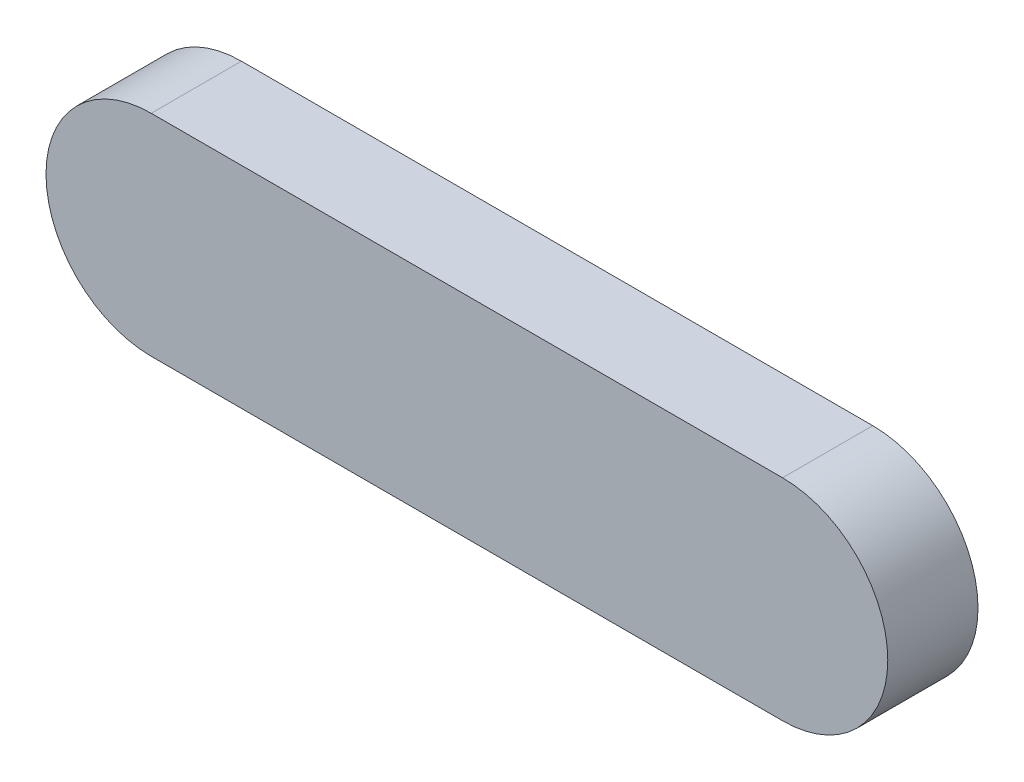
ISO-10303-21;
HEADER;
FILE_DESCRIPTION(('STEP AP214'),'2;1');
FILE_NAME('part.step','',(''),(''),'','','');
FILE_SCHEMA(('AUTOMOTIVE_DESIGN { 1 0 10303 214 1 1 1 1 }'));
ENDSEC;
DATA;
#1=APPLICATION_CONTEXT('core data for automotive mechanical design processes');
#2=APPLICATION_PROTOCOL_DEFINITION('international standard','automotive_design',2000,#1);
#3=PRODUCT_CONTEXT('',#1,'mechanical');
#4=PRODUCT('Part','Part','',(#3));
#5=PRODUCT_RELATED_PRODUCT_CATEGORY('part','',(#4));
#6=PRODUCT_DEFINITION_FORMATION('','',#4);
#7=PRODUCT_DEFINITION_CONTEXT('part definition',#1,'design');
#8=PRODUCT_DEFINITION('design','',#6,#7);
#9=PRODUCT_DEFINITION_SHAPE('','',#8);
#10=(LENGTH_UNIT() NAMED_UNIT(*) SI_UNIT(.MILLI.,.METRE.));
#11=(NAMED_UNIT(*) PLANE_ANGLE_UNIT() SI_UNIT($,.RADIAN.));
#12=(NAMED_UNIT(*) SI_UNIT($,.STERADIAN.) SOLID_ANGLE_UNIT());
#13=UNCERTAINTY_MEASURE_WITH_UNIT(LENGTH_MEASURE(1.E-05),#10,'distance_accuracy_value','');
#14=(GEOMETRIC_REPRESENTATION_CONTEXT(3) GLOBAL_UNCERTAINTY_ASSIGNED_CONTEXT((#13)) GLOBAL_UNIT_ASSIGNED_CONTEXT((#10,
#11,#12)) REPRESENTATION_CONTEXT('',''));
#15=CARTESIAN_POINT('',(0.,0.,0.));
#16=DIRECTION('',(0.,0.,1.));
#17=DIRECTION('',(1.,0.,0.));
#18=AXIS2_PLACEMENT_3D('',#15,#16,#17);
#19=CARTESIAN_POINT('',(7.0963462267137,0.710206683806182,0.));
#20=DIRECTION('',(0.,-1.,0.));
#21=DIRECTION('',(1.,0.,0.));
#22=AXIS2_PLACEMENT_3D('',#19,#20,#21);
#23=PLANE('',#22);
#24=DIRECTION('',(-1.,0.,0.));
#25=VECTOR('',#24,1.);
#26=CARTESIAN_POINT('',(7.7960662267137,0.710206683806182,0.));
#27=LINE('',#26,#25);
#28=CARTESIAN_POINT('',(7.7960662267137,0.710206683806182,0.));
#29=VERTEX_POINT('',#28);
#30=CARTESIAN_POINT('',(7.0963462267137,0.710206683806182,0.));
#31=VERTEX_POINT('',#30);
#32=EDGE_CURVE('E11',#29,#31,#27,.T.);
#33=ORIENTED_EDGE('',*,*,#32,.F.);
#34=DIRECTION('',(0.,0.,1.));
#35=VECTOR('',#34,1.);
#36=CARTESIAN_POINT('',(7.7960662267137,0.710206683806182,0.));
#37=LINE('',#36,#35);
#38=CARTESIAN_POINT('',(7.7960662267137,0.710206683806182,0.1));
#39=VERTEX_POINT('',#38);
#40=EDGE_CURVE('E24',#29,#39,#37,.T.);
#41=ORIENTED_EDGE('',*,*,#40,.T.);
#42=DIRECTION('',(1.,0.,0.));
#43=VECTOR('',#42,1.);
#44=CARTESIAN_POINT('',(7.7960662267137,0.710206683806182,0.1));
#45=LINE('',#44,#43);
#46=CARTESIAN_POINT('',(7.0963462267137,0.710206683806182,0.1));
#47=VERTEX_POINT('',#46);
#48=EDGE_CURVE('E75',#47,#39,#45,.T.);
#49=ORIENTED_EDGE('',*,*,#48,.F.);
#50=DIRECTION('',(0.,0.,1.));
#51=VECTOR('',#50,1.);
#52=CARTESIAN_POINT('',(7.0963462267137,0.710206683806182,0.));
#53=LINE('',#52,#51);
#54=EDGE_CURVE('E85',#31,#47,#53,.T.);
#55=ORIENTED_EDGE('',*,*,#54,.F.);
#56=EDGE_LOOP('',(#33,#41,#49,#55));
#57=FACE_BOUND('',#56,.T.);
#58=ADVANCED_FACE('F17',(#57),#23,.T.);
#59=CARTESIAN_POINT('',(7.0963462267137,0.826846683806181,0.));
#60=DIRECTION('',(0.,0.,1.));
#61=DIRECTION('',(0.,-1.,0.));
#62=AXIS2_PLACEMENT_3D('',#59,#60,#61);
#63=CYLINDRICAL_SURFACE('',#62,0.11664);
#64=CARTESIAN_POINT('',(7.0963462267137,0.826846683806182,0.));
#65=DIRECTION('',(0.,0.,-1.));
#66=DIRECTION('',(1.,0.,0.));
#67=AXIS2_PLACEMENT_3D('',#64,#65,#66);
#68=CIRCLE('',#67,0.11664);
#69=CARTESIAN_POINT('',(7.0963462267137,0.943486683806182,0.));
#70=VERTEX_POINT('',#69);
#71=EDGE_CURVE('E83',#31,#70,#68,.T.);
#72=ORIENTED_EDGE('',*,*,#71,.F.);
#73=ORIENTED_EDGE('',*,*,#54,.T.);
#74=CARTESIAN_POINT('',(7.0963462267137,0.826846683806181,0.1));
#75=DIRECTION('',(0.,0.,1.));
#76=DIRECTION('',(0.,-1.,0.));
#77=AXIS2_PLACEMENT_3D('',#74,#75,#76);
#78=CIRCLE('',#77,0.11664);
#79=CARTESIAN_POINT('',(7.0963462267137,0.943486683806182,0.1));
#80=VERTEX_POINT('',#79);
#81=EDGE_CURVE('E81',#80,#47,#78,.T.);
#82=ORIENTED_EDGE('',*,*,#81,.F.);
#83=DIRECTION('',(0.,0.,1.));
#84=VECTOR('',#83,1.);
#85=CARTESIAN_POINT('',(7.0963462267137,0.943486683806182,0.));
#86=LINE('',#85,#84);
#87=EDGE_CURVE('E61',#70,#80,#86,.T.);
#88=ORIENTED_EDGE('',*,*,#87,.F.);
#89=EDGE_LOOP('',(#72,#73,#82,#88));
#90=FACE_BOUND('',#89,.T.);
#91=ADVANCED_FACE('F91',(#90),#63,.T.);
#92=CARTESIAN_POINT('',(7.7960662267137,0.943486683806182,0.));
#93=DIRECTION('',(0.,1.,0.));
#94=DIRECTION('',(-1.,0.,0.));
#95=AXIS2_PLACEMENT_3D('',#92,#93,#94);
#96=PLANE('',#95);
#97=DIRECTION('',(1.,0.,0.));
#98=VECTOR('',#97,1.);
#99=CARTESIAN_POINT('',(7.0963462267137,0.943486683806182,0.));
#100=LINE('',#99,#98);
#101=CARTESIAN_POINT('',(7.7960662267137,0.943486683806182,0.));
#102=VERTEX_POINT('',#101);
#103=EDGE_CURVE('E65',#70,#102,#100,.T.);
#104=ORIENTED_EDGE('',*,*,#103,.F.);
#105=ORIENTED_EDGE('',*,*,#87,.T.);
#106=DIRECTION('',(-1.,0.,0.));
#107=VECTOR('',#106,1.);
#108=CARTESIAN_POINT('',(7.0963462267137,0.943486683806182,0.1));
#109=LINE('',#108,#107);
#110=CARTESIAN_POINT('',(7.7960662267137,0.943486683806182,0.1));
#111=VERTEX_POINT('',#110);
#112=EDGE_CURVE('E54',#111,#80,#109,.T.);
#113=ORIENTED_EDGE('',*,*,#112,.F.);
#114=DIRECTION('',(0.,0.,1.));
#115=VECTOR('',#114,1.);
#116=CARTESIAN_POINT('',(7.7960662267137,0.943486683806182,0.));
#117=LINE('',#116,#115);
#118=EDGE_CURVE('E58',#102,#111,#117,.T.);
#119=ORIENTED_EDGE('',*,*,#118,.F.);
#120=EDGE_LOOP('',(#104,#105,#113,#119));
#121=FACE_BOUND('',#120,.T.);
#122=ADVANCED_FACE('F57',(#121),#96,.T.);
#123=CARTESIAN_POINT('',(7.7960662267137,0.826846683806182,0.));
#124=DIRECTION('',(0.,0.,1.));
#125=DIRECTION('',(0.,1.,0.));
#126=AXIS2_PLACEMENT_3D('',#123,#124,#125);
#127=CYLINDRICAL_SURFACE('',#126,0.11664);
#128=CARTESIAN_POINT('',(7.7960662267137,0.826846683806182,0.));
#129=DIRECTION('',(0.,0.,-1.));
#130=DIRECTION('',(0.,1.,0.));
#131=AXIS2_PLACEMENT_3D('',#128,#129,#130);
#132=CIRCLE('',#131,0.11664);
#133=EDGE_CURVE('E71',#102,#29,#132,.T.);
#134=ORIENTED_EDGE('',*,*,#133,.F.);
#135=ORIENTED_EDGE('',*,*,#118,.T.);
#136=CARTESIAN_POINT('',(7.7960662267137,0.826846683806182,0.1));
#137=DIRECTION('',(0.,0.,1.));
#138=DIRECTION('',(0.,1.,0.));
#139=AXIS2_PLACEMENT_3D('',#136,#137,#138);
#140=CIRCLE('',#139,0.11664);
#141=EDGE_CURVE('E70',#39,#111,#140,.T.);
#142=ORIENTED_EDGE('',*,*,#141,.F.);
#143=ORIENTED_EDGE('',*,*,#40,.F.);
#144=EDGE_LOOP('',(#134,#135,#142,#143));
#145=FACE_BOUND('',#144,.T.);
#146=ADVANCED_FACE('F69',(#145),#127,.T.);
#147=CARTESIAN_POINT('',(7.4462062267137,0.826846683806182,0.));
#148=DIRECTION('',(0.,0.,1.));
#149=DIRECTION('',(1.,0.,0.));
#150=AXIS2_PLACEMENT_3D('',#147,#148,#149);
#151=PLANE('',#150);
#152=ORIENTED_EDGE('',*,*,#133,.T.);
#153=ORIENTED_EDGE('',*,*,#32,.T.);
#154=ORIENTED_EDGE('',*,*,#71,.T.);
#155=ORIENTED_EDGE('',*,*,#103,.T.);
#156=EDGE_LOOP('',(#152,#153,#154,#155));
#157=FACE_BOUND('',#156,.T.);
#158=ADVANCED_FACE('F88',(#157),#151,.F.);
#159=CARTESIAN_POINT('',(7.4462062267137,0.826846683806182,0.1));
#160=DIRECTION('',(0.,0.,1.));
#161=DIRECTION('',(1.,0.,0.));
#162=AXIS2_PLACEMENT_3D('',#159,#160,#161);
#163=PLANE('',#162);
#164=ORIENTED_EDGE('',*,*,#141,.T.);
#165=ORIENTED_EDGE('',*,*,#112,.T.);
#166=ORIENTED_EDGE('',*,*,#81,.T.);
#167=ORIENTED_EDGE('',*,*,#48,.T.);
#168=EDGE_LOOP('',(#164,#165,#166,#167));
#169=FACE_BOUND('',#168,.T.);
#170=ADVANCED_FACE('F74',(#169),#163,.T.);
#171=CLOSED_SHELL('',(#58,#91,#122,#146,#158,#170));
#172=MANIFOLD_SOLID_BREP('B1',#171);
#173=ADVANCED_BREP_SHAPE_REPRESENTATION('',(#18,#172),#14);
#174=SHAPE_DEFINITION_REPRESENTATION(#9,#173);
ENDSEC;
END-ISO-10303-21;
